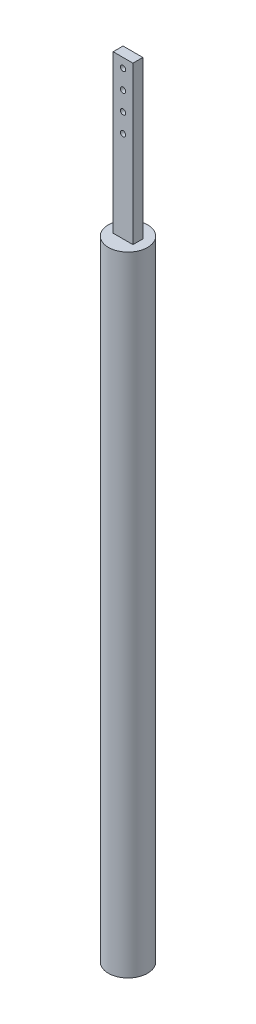
ISO-10303-21;
HEADER;
FILE_DESCRIPTION(('STEP AP214'),'2;1');
FILE_NAME('part.step','',(''),(''),'','','');
FILE_SCHEMA(('AUTOMOTIVE_DESIGN { 1 0 10303 214 1 1 1 1 }'));
ENDSEC;
DATA;
#1=APPLICATION_CONTEXT('core data for automotive mechanical design processes');
#2=APPLICATION_PROTOCOL_DEFINITION('international standard','automotive_design',2000,#1);
#3=PRODUCT_CONTEXT('',#1,'mechanical');
#4=PRODUCT('Part','Part','',(#3));
#5=PRODUCT_RELATED_PRODUCT_CATEGORY('part','',(#4));
#6=PRODUCT_DEFINITION_FORMATION('','',#4);
#7=PRODUCT_DEFINITION_CONTEXT('part definition',#1,'design');
#8=PRODUCT_DEFINITION('design','',#6,#7);
#9=PRODUCT_DEFINITION_SHAPE('','',#8);
#10=(LENGTH_UNIT() NAMED_UNIT(*) SI_UNIT(.MILLI.,.METRE.));
#11=(NAMED_UNIT(*) PLANE_ANGLE_UNIT() SI_UNIT($,.RADIAN.));
#12=(NAMED_UNIT(*) SI_UNIT($,.STERADIAN.) SOLID_ANGLE_UNIT());
#13=UNCERTAINTY_MEASURE_WITH_UNIT(LENGTH_MEASURE(1.E-05),#10,'distance_accuracy_value','');
#14=(GEOMETRIC_REPRESENTATION_CONTEXT(3) GLOBAL_UNCERTAINTY_ASSIGNED_CONTEXT((#13)) GLOBAL_UNIT_ASSIGNED_CONTEXT((#10,
#11,#12)) REPRESENTATION_CONTEXT('',''));
#15=CARTESIAN_POINT('',(0.,0.,0.));
#16=DIRECTION('',(0.,0.,1.));
#17=DIRECTION('',(1.,0.,0.));
#18=AXIS2_PLACEMENT_3D('',#15,#16,#17);
#19=CARTESIAN_POINT('',(0.,127.,0.));
#20=DIRECTION('',(0.,-1.,0.));
#21=DIRECTION('',(0.,0.,-1.));
#22=AXIS2_PLACEMENT_3D('',#19,#20,#21);
#23=CYLINDRICAL_SURFACE('',#22,3.9624);
#24=CARTESIAN_POINT('',(0.,127.,0.));
#25=DIRECTION('',(0.,1.,0.));
#26=DIRECTION('',(0.,0.,1.));
#27=AXIS2_PLACEMENT_3D('',#24,#25,#26);
#28=CIRCLE('',#27,3.9624);
#29=CARTESIAN_POINT('',(0.,127.,3.9624));
#30=VERTEX_POINT('',#29);
#31=EDGE_CURVE('E11',#30,#30,#28,.T.);
#32=ORIENTED_EDGE('',*,*,#31,.F.);
#33=EDGE_LOOP('',(#32));
#34=FACE_BOUND('',#33,.T.);
#35=CARTESIAN_POINT('',(0.,0.,0.));
#36=DIRECTION('',(0.,1.,0.));
#37=DIRECTION('',(0.,0.,1.));
#38=AXIS2_PLACEMENT_3D('',#35,#36,#37);
#39=CIRCLE('',#38,3.9624);
#40=CARTESIAN_POINT('',(0.,0.,3.9624));
#41=VERTEX_POINT('',#40);
#42=EDGE_CURVE('E42',#41,#41,#39,.T.);
#43=ORIENTED_EDGE('',*,*,#42,.T.);
#44=EDGE_LOOP('',(#43));
#45=FACE_BOUND('',#44,.T.);
#46=ADVANCED_FACE('F39',(#34,#45),#23,.T.);
#47=CARTESIAN_POINT('',(0.,127.,0.));
#48=DIRECTION('',(0.,1.,0.));
#49=DIRECTION('',(0.,0.,1.));
#50=AXIS2_PLACEMENT_3D('',#47,#48,#49);
#51=PLANE('',#50);
#52=DIRECTION('',(-1.,0.,0.));
#53=VECTOR('',#52,1.);
#54=CARTESIAN_POINT('',(2.000000128,127.,-1.));
#55=LINE('',#54,#53);
#56=CARTESIAN_POINT('',(2.000000128,127.,-1.));
#57=VERTEX_POINT('',#56);
#58=CARTESIAN_POINT('',(-2.,127.,-1.));
#59=VERTEX_POINT('',#58);
#60=EDGE_CURVE('E54',#57,#59,#55,.T.);
#61=ORIENTED_EDGE('',*,*,#60,.F.);
#62=DIRECTION('',(0.,0.,-1.));
#63=VECTOR('',#62,1.);
#64=CARTESIAN_POINT('',(2.000000128,127.,1.));
#65=LINE('',#64,#63);
#66=CARTESIAN_POINT('',(2.000000128,127.,1.));
#67=VERTEX_POINT('',#66);
#68=EDGE_CURVE('E58',#67,#57,#65,.T.);
#69=ORIENTED_EDGE('',*,*,#68,.F.);
#70=DIRECTION('',(1.,0.,0.));
#71=VECTOR('',#70,1.);
#72=CARTESIAN_POINT('',(-2.,127.,1.));
#73=LINE('',#72,#71);
#74=CARTESIAN_POINT('',(-2.,127.,1.));
#75=VERTEX_POINT('',#74);
#76=EDGE_CURVE('E118',#75,#67,#73,.T.);
#77=ORIENTED_EDGE('',*,*,#76,.F.);
#78=DIRECTION('',(0.,0.,1.));
#79=VECTOR('',#78,1.);
#80=CARTESIAN_POINT('',(-2.,127.,-1.));
#81=LINE('',#80,#79);
#82=EDGE_CURVE('E121',#59,#75,#81,.T.);
#83=ORIENTED_EDGE('',*,*,#82,.F.);
#84=EDGE_LOOP('',(#61,#69,#77,#83));
#85=FACE_BOUND('',#84,.T.);
#86=ORIENTED_EDGE('',*,*,#31,.T.);
#87=EDGE_LOOP('',(#86));
#88=FACE_BOUND('',#87,.T.);
#89=ADVANCED_FACE('F188',(#85,#88),#51,.T.);
#90=CARTESIAN_POINT('',(0.,0.,0.));
#91=DIRECTION('',(0.,1.,0.));
#92=DIRECTION('',(0.,0.,1.));
#93=AXIS2_PLACEMENT_3D('',#90,#91,#92);
#94=PLANE('',#93);
#95=ORIENTED_EDGE('',*,*,#42,.F.);
#96=EDGE_LOOP('',(#95));
#97=FACE_BOUND('',#96,.T.);
#98=ADVANCED_FACE('F167',(#97),#94,.F.);
#99=CARTESIAN_POINT('',(2.000000128,158.75,-1.));
#100=DIRECTION('',(0.,0.,1.));
#101=DIRECTION('',(1.,0.,0.));
#102=AXIS2_PLACEMENT_3D('',#99,#100,#101);
#103=PLANE('',#102);
#104=CARTESIAN_POINT('',(1.66262403150999E-12,156.845,-1.));
#105=DIRECTION('',(0.,0.,-1.));
#106=DIRECTION('',(-1.,0.,0.));
#107=AXIS2_PLACEMENT_3D('',#104,#105,#106);
#108=CIRCLE('',#107,0.533399999999992);
#109=CARTESIAN_POINT('',(-0.53339999999833,156.845,-1.));
#110=VERTEX_POINT('',#109);
#111=EDGE_CURVE('E143',#110,#110,#108,.T.);
#112=ORIENTED_EDGE('',*,*,#111,.F.);
#113=EDGE_LOOP('',(#112));
#114=FACE_BOUND('',#113,.T.);
#115=CARTESIAN_POINT('',(1.54290113640106E-12,145.415,-1.));
#116=DIRECTION('',(0.,0.,-1.));
#117=DIRECTION('',(-1.,0.,0.));
#118=AXIS2_PLACEMENT_3D('',#115,#116,#117);
#119=CIRCLE('',#118,0.533399999999992);
#120=CARTESIAN_POINT('',(-0.533399999998449,145.415,-1.));
#121=VERTEX_POINT('',#120);
#122=EDGE_CURVE('E151',#121,#121,#119,.T.);
#123=ORIENTED_EDGE('',*,*,#122,.F.);
#124=EDGE_LOOP('',(#123));
#125=FACE_BOUND('',#124,.T.);
#126=CARTESIAN_POINT('',(1.58280876810404E-12,149.225,-1.));
#127=DIRECTION('',(0.,0.,-1.));
#128=DIRECTION('',(-1.,0.,0.));
#129=AXIS2_PLACEMENT_3D('',#126,#127,#128);
#130=CIRCLE('',#129,0.533399999999992);
#131=CARTESIAN_POINT('',(-0.533399999998409,149.225,-1.));
#132=VERTEX_POINT('',#131);
#133=EDGE_CURVE('E135',#132,#132,#130,.T.);
#134=ORIENTED_EDGE('',*,*,#133,.F.);
#135=EDGE_LOOP('',(#134));
#136=FACE_BOUND('',#135,.T.);
#137=CARTESIAN_POINT('',(1.62271639980701E-12,153.035,-1.));
#138=DIRECTION('',(0.,0.,-1.));
#139=DIRECTION('',(-1.,0.,0.));
#140=AXIS2_PLACEMENT_3D('',#137,#138,#139);
#141=CIRCLE('',#140,0.533399999999992);
#142=CARTESIAN_POINT('',(-0.53339999999837,153.035,-1.));
#143=VERTEX_POINT('',#142);
#144=EDGE_CURVE('E131',#143,#143,#141,.T.);
#145=ORIENTED_EDGE('',*,*,#144,.F.);
#146=EDGE_LOOP('',(#145));
#147=FACE_BOUND('',#146,.T.);
#148=ORIENTED_EDGE('',*,*,#60,.T.);
#149=DIRECTION('',(0.,-1.,0.));
#150=VECTOR('',#149,1.);
#151=CARTESIAN_POINT('',(-2.,158.75,-1.));
#152=LINE('',#151,#150);
#153=CARTESIAN_POINT('',(-2.,158.75,-1.));
#154=VERTEX_POINT('',#153);
#155=EDGE_CURVE('E83',#154,#59,#152,.T.);
#156=ORIENTED_EDGE('',*,*,#155,.F.);
#157=DIRECTION('',(-1.,0.,0.));
#158=VECTOR('',#157,1.);
#159=CARTESIAN_POINT('',(2.000000128,158.75,-1.));
#160=LINE('',#159,#158);
#161=CARTESIAN_POINT('',(2.000000128,158.75,-1.));
#162=VERTEX_POINT('',#161);
#163=EDGE_CURVE('E90',#162,#154,#160,.T.);
#164=ORIENTED_EDGE('',*,*,#163,.F.);
#165=DIRECTION('',(0.,-1.,0.));
#166=VECTOR('',#165,1.);
#167=CARTESIAN_POINT('',(2.000000128,158.75,-1.));
#168=LINE('',#167,#166);
#169=EDGE_CURVE('E113',#162,#57,#168,.T.);
#170=ORIENTED_EDGE('',*,*,#169,.T.);
#171=EDGE_LOOP('',(#148,#156,#164,#170));
#172=FACE_BOUND('',#171,.T.);
#173=ADVANCED_FACE('F101',(#114,#125,#136,#147,#172),#103,.F.);
#174=CARTESIAN_POINT('',(-2.,158.75,-1.));
#175=DIRECTION('',(1.,0.,0.));
#176=DIRECTION('',(0.,0.,-1.));
#177=AXIS2_PLACEMENT_3D('',#174,#175,#176);
#178=PLANE('',#177);
#179=ORIENTED_EDGE('',*,*,#82,.T.);
#180=DIRECTION('',(0.,-1.,0.));
#181=VECTOR('',#180,1.);
#182=CARTESIAN_POINT('',(-2.,158.75,1.));
#183=LINE('',#182,#181);
#184=CARTESIAN_POINT('',(-2.,158.75,1.));
#185=VERTEX_POINT('',#184);
#186=EDGE_CURVE('E85',#185,#75,#183,.T.);
#187=ORIENTED_EDGE('',*,*,#186,.F.);
#188=DIRECTION('',(0.,0.,1.));
#189=VECTOR('',#188,1.);
#190=CARTESIAN_POINT('',(-2.,158.75,-1.));
#191=LINE('',#190,#189);
#192=EDGE_CURVE('E78',#154,#185,#191,.T.);
#193=ORIENTED_EDGE('',*,*,#192,.F.);
#194=ORIENTED_EDGE('',*,*,#155,.T.);
#195=EDGE_LOOP('',(#179,#187,#193,#194));
#196=FACE_BOUND('',#195,.T.);
#197=ADVANCED_FACE('F81',(#196),#178,.F.);
#198=CARTESIAN_POINT('',(-2.,158.75,1.));
#199=DIRECTION('',(0.,0.,-1.));
#200=DIRECTION('',(-1.,0.,0.));
#201=AXIS2_PLACEMENT_3D('',#198,#199,#200);
#202=PLANE('',#201);
#203=CARTESIAN_POINT('',(1.66284087193755E-12,156.845,1.));
#204=DIRECTION('',(0.,0.,-1.));
#205=DIRECTION('',(-1.,0.,0.));
#206=AXIS2_PLACEMENT_3D('',#203,#204,#205);
#207=CIRCLE('',#206,0.533399999999992);
#208=CARTESIAN_POINT('',(-0.533399999998329,156.845,1.));
#209=VERTEX_POINT('',#208);
#210=EDGE_CURVE('E139',#209,#209,#207,.T.);
#211=ORIENTED_EDGE('',*,*,#210,.T.);
#212=EDGE_LOOP('',(#211));
#213=FACE_BOUND('',#212,.T.);
#214=CARTESIAN_POINT('',(1.54311797682862E-12,145.415,1.));
#215=DIRECTION('',(0.,0.,-1.));
#216=DIRECTION('',(-1.,0.,0.));
#217=AXIS2_PLACEMENT_3D('',#214,#215,#216);
#218=CIRCLE('',#217,0.533399999999992);
#219=CARTESIAN_POINT('',(-0.533399999998449,145.415,1.));
#220=VERTEX_POINT('',#219);
#221=EDGE_CURVE('E147',#220,#220,#218,.T.);
#222=ORIENTED_EDGE('',*,*,#221,.T.);
#223=EDGE_LOOP('',(#222));
#224=FACE_BOUND('',#223,.T.);
#225=CARTESIAN_POINT('',(1.5830256085316E-12,149.225,1.));
#226=DIRECTION('',(0.,0.,-1.));
#227=DIRECTION('',(-1.,0.,0.));
#228=AXIS2_PLACEMENT_3D('',#225,#226,#227);
#229=CIRCLE('',#228,0.533399999999992);
#230=CARTESIAN_POINT('',(-0.533399999998409,149.225,1.));
#231=VERTEX_POINT('',#230);
#232=EDGE_CURVE('E155',#231,#231,#229,.T.);
#233=ORIENTED_EDGE('',*,*,#232,.T.);
#234=EDGE_LOOP('',(#233));
#235=FACE_BOUND('',#234,.T.);
#236=CARTESIAN_POINT('',(1.62293324023457E-12,153.035,1.));
#237=DIRECTION('',(0.,0.,-1.));
#238=DIRECTION('',(-1.,0.,0.));
#239=AXIS2_PLACEMENT_3D('',#236,#237,#238);
#240=CIRCLE('',#239,0.533399999999992);
#241=CARTESIAN_POINT('',(-0.533399999998369,153.035,1.));
#242=VERTEX_POINT('',#241);
#243=EDGE_CURVE('E126',#242,#242,#240,.T.);
#244=ORIENTED_EDGE('',*,*,#243,.T.);
#245=EDGE_LOOP('',(#244));
#246=FACE_BOUND('',#245,.T.);
#247=ORIENTED_EDGE('',*,*,#76,.T.);
#248=DIRECTION('',(0.,-1.,0.));
#249=VECTOR('',#248,1.);
#250=CARTESIAN_POINT('',(2.000000128,158.75,1.));
#251=LINE('',#250,#249);
#252=CARTESIAN_POINT('',(2.000000128,158.75,1.));
#253=VERTEX_POINT('',#252);
#254=EDGE_CURVE('E107',#253,#67,#251,.T.);
#255=ORIENTED_EDGE('',*,*,#254,.F.);
#256=DIRECTION('',(1.,0.,0.));
#257=VECTOR('',#256,1.);
#258=CARTESIAN_POINT('',(-2.,158.75,1.));
#259=LINE('',#258,#257);
#260=EDGE_CURVE('E89',#185,#253,#259,.T.);
#261=ORIENTED_EDGE('',*,*,#260,.F.);
#262=ORIENTED_EDGE('',*,*,#186,.T.);
#263=EDGE_LOOP('',(#247,#255,#261,#262));
#264=FACE_BOUND('',#263,.T.);
#265=ADVANCED_FACE('F204',(#213,#224,#235,#246,#264),#202,.F.);
#266=CARTESIAN_POINT('',(2.000000128,158.75,1.));
#267=DIRECTION('',(-1.,0.,0.));
#268=DIRECTION('',(0.,0.,1.));
#269=AXIS2_PLACEMENT_3D('',#266,#267,#268);
#270=PLANE('',#269);
#271=ORIENTED_EDGE('',*,*,#68,.T.);
#272=ORIENTED_EDGE('',*,*,#169,.F.);
#273=DIRECTION('',(0.,0.,-1.));
#274=VECTOR('',#273,1.);
#275=CARTESIAN_POINT('',(2.000000128,158.75,1.));
#276=LINE('',#275,#274);
#277=EDGE_CURVE('E95',#253,#162,#276,.T.);
#278=ORIENTED_EDGE('',*,*,#277,.F.);
#279=ORIENTED_EDGE('',*,*,#254,.T.);
#280=EDGE_LOOP('',(#271,#272,#278,#279));
#281=FACE_BOUND('',#280,.T.);
#282=ADVANCED_FACE('F183',(#281),#270,.F.);
#283=CARTESIAN_POINT('',(0.,158.75,0.));
#284=DIRECTION('',(0.,1.,0.));
#285=DIRECTION('',(0.,0.,1.));
#286=AXIS2_PLACEMENT_3D('',#283,#284,#285);
#287=PLANE('',#286);
#288=ORIENTED_EDGE('',*,*,#163,.T.);
#289=ORIENTED_EDGE('',*,*,#192,.T.);
#290=ORIENTED_EDGE('',*,*,#260,.T.);
#291=ORIENTED_EDGE('',*,*,#277,.T.);
#292=EDGE_LOOP('',(#288,#289,#290,#291));
#293=FACE_BOUND('',#292,.T.);
#294=ADVANCED_FACE('F93',(#293),#287,.T.);
#295=CARTESIAN_POINT('',(1.62293324023457E-12,153.035,1.));
#296=DIRECTION('',(0.,0.,-1.));
#297=DIRECTION('',(-1.,0.,0.));
#298=AXIS2_PLACEMENT_3D('',#295,#296,#297);
#299=CYLINDRICAL_SURFACE('',#298,0.533399999999992);
#300=ORIENTED_EDGE('',*,*,#243,.F.);
#301=EDGE_LOOP('',(#300));
#302=FACE_BOUND('',#301,.T.);
#303=ORIENTED_EDGE('',*,*,#144,.T.);
#304=EDGE_LOOP('',(#303));
#305=FACE_BOUND('',#304,.T.);
#306=ADVANCED_FACE('F172',(#302,#305),#299,.F.);
#307=CARTESIAN_POINT('',(1.5830256085316E-12,149.225,1.));
#308=DIRECTION('',(0.,0.,-1.));
#309=DIRECTION('',(-1.,0.,0.));
#310=AXIS2_PLACEMENT_3D('',#307,#308,#309);
#311=CYLINDRICAL_SURFACE('',#310,0.533399999999992);
#312=ORIENTED_EDGE('',*,*,#232,.F.);
#313=EDGE_LOOP('',(#312));
#314=FACE_BOUND('',#313,.T.);
#315=ORIENTED_EDGE('',*,*,#133,.T.);
#316=EDGE_LOOP('',(#315));
#317=FACE_BOUND('',#316,.T.);
#318=ADVANCED_FACE('F163',(#314,#317),#311,.F.);
#319=CARTESIAN_POINT('',(1.54311797682862E-12,145.415,1.));
#320=DIRECTION('',(0.,0.,-1.));
#321=DIRECTION('',(-1.,0.,0.));
#322=AXIS2_PLACEMENT_3D('',#319,#320,#321);
#323=CYLINDRICAL_SURFACE('',#322,0.533399999999992);
#324=ORIENTED_EDGE('',*,*,#221,.F.);
#325=EDGE_LOOP('',(#324));
#326=FACE_BOUND('',#325,.T.);
#327=ORIENTED_EDGE('',*,*,#122,.T.);
#328=EDGE_LOOP('',(#327));
#329=FACE_BOUND('',#328,.T.);
#330=ADVANCED_FACE('F180',(#326,#329),#323,.F.);
#331=CARTESIAN_POINT('',(1.66284087193755E-12,156.845,1.));
#332=DIRECTION('',(0.,0.,-1.));
#333=DIRECTION('',(-1.,0.,0.));
#334=AXIS2_PLACEMENT_3D('',#331,#332,#333);
#335=CYLINDRICAL_SURFACE('',#334,0.533399999999992);
#336=ORIENTED_EDGE('',*,*,#210,.F.);
#337=EDGE_LOOP('',(#336));
#338=FACE_BOUND('',#337,.T.);
#339=ORIENTED_EDGE('',*,*,#111,.T.);
#340=EDGE_LOOP('',(#339));
#341=FACE_BOUND('',#340,.T.);
#342=ADVANCED_FACE('F253',(#338,#341),#335,.F.);
#343=CLOSED_SHELL('',(#46,#89,#98,#173,#197,#265,#282,#294,#306,#318,#330,#342));
#344=MANIFOLD_SOLID_BREP('B2',#343);
#345=ADVANCED_BREP_SHAPE_REPRESENTATION('',(#18,#344),#14);
#346=SHAPE_DEFINITION_REPRESENTATION(#9,#345);
ENDSEC;
END-ISO-10303-21;
